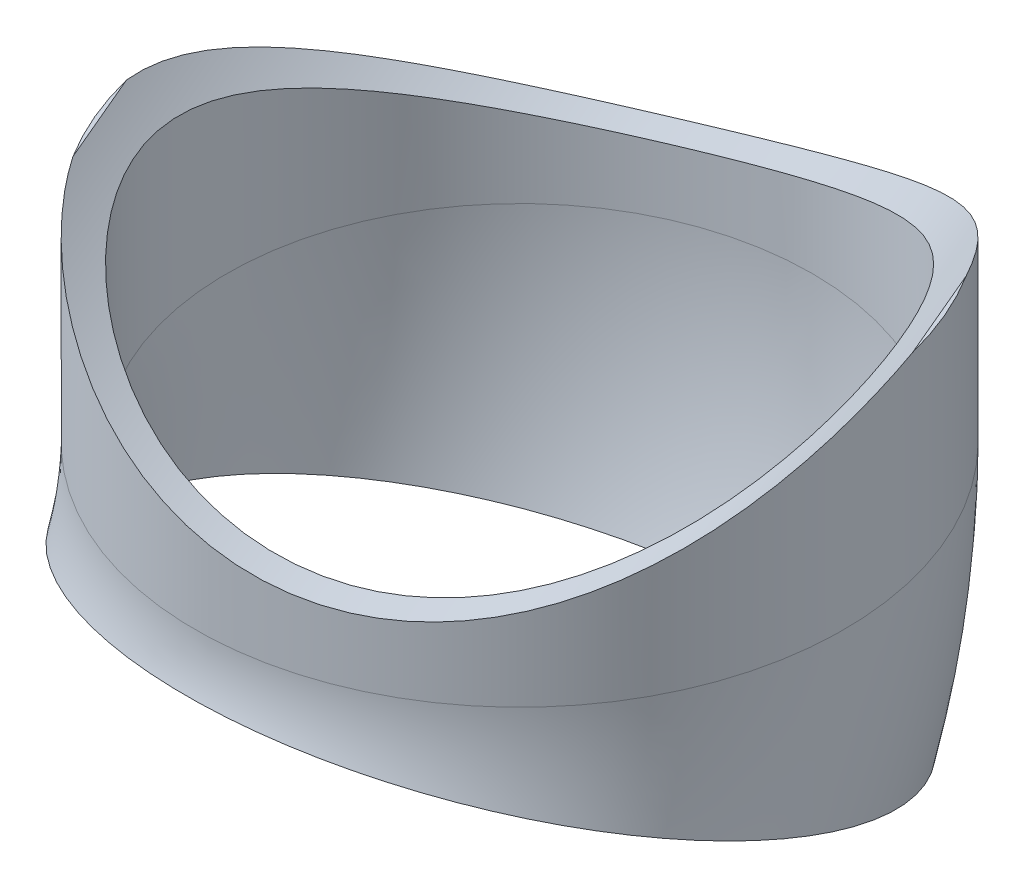
ISO-10303-21;
HEADER;
FILE_DESCRIPTION(('STEP AP214'),'2;1');
FILE_NAME('part.step','',(''),(''),'','','');
FILE_SCHEMA(('AUTOMOTIVE_DESIGN { 1 0 10303 214 1 1 1 1 }'));
ENDSEC;
DATA;
#1=APPLICATION_CONTEXT('core data for automotive mechanical design processes');
#2=APPLICATION_PROTOCOL_DEFINITION('international standard','automotive_design',2000,#1);
#3=PRODUCT_CONTEXT('',#1,'mechanical');
#4=PRODUCT('Part','Part','',(#3));
#5=PRODUCT_RELATED_PRODUCT_CATEGORY('part','',(#4));
#6=PRODUCT_DEFINITION_FORMATION('','',#4);
#7=PRODUCT_DEFINITION_CONTEXT('part definition',#1,'design');
#8=PRODUCT_DEFINITION('design','',#6,#7);
#9=PRODUCT_DEFINITION_SHAPE('','',#8);
#10=(LENGTH_UNIT() NAMED_UNIT(*) SI_UNIT(.MILLI.,.METRE.));
#11=(NAMED_UNIT(*) PLANE_ANGLE_UNIT() SI_UNIT($,.RADIAN.));
#12=(NAMED_UNIT(*) SI_UNIT($,.STERADIAN.) SOLID_ANGLE_UNIT());
#13=UNCERTAINTY_MEASURE_WITH_UNIT(LENGTH_MEASURE(1.E-05),#10,'distance_accuracy_value','');
#14=(GEOMETRIC_REPRESENTATION_CONTEXT(3) GLOBAL_UNCERTAINTY_ASSIGNED_CONTEXT((#13)) GLOBAL_UNIT_ASSIGNED_CONTEXT((#10,
#11,#12)) REPRESENTATION_CONTEXT('',''));
#15=CARTESIAN_POINT('',(0.,0.,0.));
#16=DIRECTION('',(0.,0.,1.));
#17=DIRECTION('',(1.,0.,0.));
#18=AXIS2_PLACEMENT_3D('',#15,#16,#17);
#19=CARTESIAN_POINT('',(0.,7.9375,0.));
#20=DIRECTION('',(0.,1.,0.));
#21=DIRECTION('',(0.,0.,1.));
#22=AXIS2_PLACEMENT_3D('',#19,#20,#21);
#23=PLANE('',#22);
#24=DIRECTION('',(0.390731128489278,0.,0.920504853452439));
#25=VECTOR('',#24,1.);
#26=CARTESIAN_POINT('',(-22.3861132780056,7.9375,-12.93028808634));
#27=LINE('',#26,#25);
#28=CARTESIAN_POINT('',(-15.2799945251246,7.9375,3.81067858945914));
#29=VERTEX_POINT('',#28);
#30=CARTESIAN_POINT('',(-13.3555488731417,7.9375,8.34438843158224));
#31=VERTEX_POINT('',#30);
#32=EDGE_CURVE('E60',#29,#31,#27,.T.);
#33=ORIENTED_EDGE('',*,*,#32,.F.);
#34=CARTESIAN_POINT('',(0.,7.9375,0.));
#35=DIRECTION('',(0.,1.,0.));
#36=DIRECTION('',(0.,0.,1.));
#37=AXIS2_PLACEMENT_3D('',#34,#35,#36);
#38=CIRCLE('',#37,15.748);
#39=EDGE_CURVE('E48',#29,#31,#38,.T.);
#40=ORIENTED_EDGE('',*,*,#39,.T.);
#41=EDGE_LOOP('',(#33,#40));
#42=FACE_BOUND('',#41,.T.);
#43=ADVANCED_FACE('F33',(#42),#23,.T.);
#44=DIRECTION('',(0.390731128489278,0.,0.920504853452439));
#45=VECTOR('',#44,1.);
#46=CARTESIAN_POINT('',(6.24943012026066,7.9375,-25.0853551073814));
#47=LINE('',#46,#45);
#48=CARTESIAN_POINT('',(15.2799945251246,7.9375,-3.81067858945914));
#49=VERTEX_POINT('',#48);
#50=CARTESIAN_POINT('',(13.3555488731417,7.9375,-8.34438843158225));
#51=VERTEX_POINT('',#50);
#52=EDGE_CURVE('E55',#49,#51,#47,.F.);
#53=ORIENTED_EDGE('',*,*,#52,.F.);
#54=EDGE_CURVE('E11',#49,#51,#38,.T.);
#55=ORIENTED_EDGE('',*,*,#54,.T.);
#56=EDGE_LOOP('',(#53,#55));
#57=FACE_BOUND('',#56,.T.);
#58=ADVANCED_FACE('F119',(#57),#23,.T.);
#59=CARTESIAN_POINT('',(0.,7.9375,0.));
#60=DIRECTION('',(0.,-1.,0.));
#61=DIRECTION('',(0.,0.,-1.));
#62=AXIS2_PLACEMENT_3D('',#59,#60,#61);
#63=CYLINDRICAL_SURFACE('',#62,15.748);
#64=ORIENTED_EDGE('',*,*,#54,.F.);
#65=CARTESIAN_POINT('',(15.2799945251246,7.9375,-3.81067858945914));
#66=CARTESIAN_POINT('',(15.3320366857805,7.90455896285192,-3.60201193193875));
#67=CARTESIAN_POINT('',(15.3796372478099,7.86764607105217,-3.39292524159516));
#68=CARTESIAN_POINT('',(15.4660149873519,7.78651333210653,-2.97447251707182));
#69=CARTESIAN_POINT('',(15.5047972060592,7.74229768482387,-2.76510671166591));
#70=CARTESIAN_POINT('',(15.6079367863265,7.59979518448622,-2.13798860250518));
#71=CARTESIAN_POINT('',(15.6593141877781,7.49150302754385,-1.72029771874254));
#72=CARTESIAN_POINT('',(15.7281885461575,7.2546596805107,-0.891731495380128));
#73=CARTESIAN_POINT('',(15.745953416413,7.12627759844423,-0.480828363020215));
#74=CARTESIAN_POINT('',(15.7497131185979,6.85374341717223,0.335895558816913));
#75=CARTESIAN_POINT('',(15.735701168257,6.70958795763341,0.741715244722722));
#76=CARTESIAN_POINT('',(15.6772709493108,6.41142660076566,1.54371878798323));
#77=CARTESIAN_POINT('',(15.6330971473558,6.25750885964597,1.93995379222663));
#78=CARTESIAN_POINT('',(15.5154870485849,5.94290225423745,2.72520629041811));
#79=CARTESIAN_POINT('',(15.4420562501851,5.78221466731164,3.11422512616859));
#80=CARTESIAN_POINT('',(15.2662318549309,5.45710671647442,3.88570769116736));
#81=CARTESIAN_POINT('',(15.1637394747287,5.29267541145137,4.26814426077968));
#82=CARTESIAN_POINT('',(14.9302658599472,4.96392967867222,5.02426441075635));
#83=CARTESIAN_POINT('',(14.7992838870286,4.79961525405594,5.39794776399339));
#84=CARTESIAN_POINT('',(14.4815605470954,4.44340242365529,6.20531743484061));
#85=CARTESIAN_POINT('',(14.2889601592404,4.25215627721452,6.63700501507327));
#86=CARTESIAN_POINT('',(13.8638223441698,3.87900257193419,7.48456902365025));
#87=CARTESIAN_POINT('',(13.6312782743032,3.69709657291124,7.90044280808133));
#88=CARTESIAN_POINT('',(13.1267799557184,3.3476259387248,8.71293544911435));
#89=CARTESIAN_POINT('',(12.854898566242,3.18003568168934,9.10958813182908));
#90=CARTESIAN_POINT('',(12.4178310399822,2.94266439910452,9.68789857060618));
#91=CARTESIAN_POINT('',(12.2672826259806,2.86588265983027,9.87787412084352));
#92=CARTESIAN_POINT('',(11.9564667763607,2.71749166032052,10.2519043402803));
#93=CARTESIAN_POINT('',(11.7961968714701,2.6458837244443,10.435957486858));
#94=CARTESIAN_POINT('',(11.380386635753,2.4727078558115,10.8914925826181));
#95=CARTESIAN_POINT('',(11.1185918782349,2.37489183875273,11.1587435192569));
#96=CARTESIAN_POINT('',(10.5738904665414,2.19439232260658,11.676190807934));
#97=CARTESIAN_POINT('',(10.2909883151123,2.11170560897215,11.9263907757125));
#98=CARTESIAN_POINT('',(9.70536946177965,1.96314191651582,12.4076120138336));
#99=CARTESIAN_POINT('',(9.40266300666182,1.89725632984624,12.6386430640339));
#100=CARTESIAN_POINT('',(8.77895724999061,1.78366904663009,13.0795742311575));
#101=CARTESIAN_POINT('',(8.45795753802717,1.73596775823384,13.2894738737044));
#102=CARTESIAN_POINT('',(7.79843639489727,1.65969101591434,13.6869542550627));
#103=CARTESIAN_POINT('',(7.45984935329477,1.63119368986164,13.8744412999822));
#104=CARTESIAN_POINT('',(6.76888814955622,1.59432187884636,14.2243317172691));
#105=CARTESIAN_POINT('',(6.41651399688963,1.58594738006299,14.3867351068644));
#106=CARTESIAN_POINT('',(5.70082671266374,1.5895261580785,14.685039350997));
#107=CARTESIAN_POINT('',(5.33751365729834,1.60147929331932,14.8209403900847));
#108=CARTESIAN_POINT('',(4.60296445361042,1.64542127263834,15.065258948858));
#109=CARTESIAN_POINT('',(4.23172857176633,1.67740944387548,15.1736773913261));
#110=CARTESIAN_POINT('',(3.50808096437277,1.75800846448209,15.356536444526));
#111=CARTESIAN_POINT('',(3.15596875403457,1.80543630018448,15.4326960006647));
#112=CARTESIAN_POINT('',(2.44983149525711,1.91623038484285,15.5604164529968));
#113=CARTESIAN_POINT('',(2.09580654570445,1.97959581741311,15.6119786087731));
#114=CARTESIAN_POINT('',(1.38798306538087,2.12106640568188,15.6907565108017));
#115=CARTESIAN_POINT('',(1.03418456032579,2.19917301157121,15.7179698601808));
#116=CARTESIAN_POINT('',(0.328772370283485,2.36873010806692,15.7485260427282));
#117=CARTESIAN_POINT('',(-0.022841191488344,2.46018134422288,15.7518675416815));
#118=CARTESIAN_POINT('',(-0.748010755051236,2.66209363965791,15.7347084735392));
#119=CARTESIAN_POINT('',(-1.12127218343758,2.77345933453348,15.7124310702584));
#120=CARTESIAN_POINT('',(-1.86161793376789,3.00784374431504,15.6420005551283));
#121=CARTESIAN_POINT('',(-2.22870201326365,3.13086291534561,15.5938464301026));
#122=CARTESIAN_POINT('',(-2.95543492776441,3.38656266588515,15.4725782145211));
#123=CARTESIAN_POINT('',(-3.31508096173873,3.5192468029466,15.3994548962229));
#124=CARTESIAN_POINT('',(-4.02571565546071,3.79217018205666,15.2291382975809));
#125=CARTESIAN_POINT('',(-4.37670327916049,3.93241032190976,15.1319421519459));
#126=CARTESIAN_POINT('',(-5.12942537058212,4.24323711181093,14.8953043442459));
#127=CARTESIAN_POINT('',(-5.52935234547447,4.41485531423962,14.7514533854227));
#128=CARTESIAN_POINT('',(-6.3148671469826,4.76208040701232,14.4326601119621));
#129=CARTESIAN_POINT('',(-6.70045273529299,4.93768791314755,14.257712968464));
#130=CARTESIAN_POINT('',(-7.45669873005661,5.28936906876153,13.8771955739696));
#131=CARTESIAN_POINT('',(-7.82733971376304,5.46544302679361,13.6715870063728));
#132=CARTESIAN_POINT('',(-8.5521107729005,5.81375391037324,13.2303017332828));
#133=CARTESIAN_POINT('',(-8.90624333197006,5.98599141105399,12.9946295708232));
#134=CARTESIAN_POINT('',(-9.56131612678734,6.30482484131958,12.5190763544857));
#135=CARTESIAN_POINT('',(-9.86398194867364,6.45223646215437,12.2821189725747));
#136=CARTESIAN_POINT('',(-10.4540286372952,6.73667425653732,11.7839663307474));
#137=CARTESIAN_POINT('',(-10.7414072427568,6.87369889491774,11.522767500651));
#138=CARTESIAN_POINT('',(-11.2983011918544,7.13273048934452,10.9772162806014));
#139=CARTESIAN_POINT('',(-11.5678785905545,7.25479104170177,10.6929529676111));
#140=CARTESIAN_POINT('',(-12.0882556360509,7.47995977545273,10.1009242493588));
#141=CARTESIAN_POINT('',(-12.3390692117965,7.58308209967954,9.7931766270123));
#142=CARTESIAN_POINT('',(-12.7157767376615,7.72637589128562,9.29300789629001));
#143=CARTESIAN_POINT('',(-12.8488284315008,7.77449711313874,9.10819833694832));
#144=CARTESIAN_POINT('',(-13.1077343111177,7.8624346193465,8.73150083820581));
#145=CARTESIAN_POINT('',(-13.2335834372788,7.90224511637193,8.53960807499182));
#146=CARTESIAN_POINT('',(-13.3555488731417,7.9375,8.34438843158225));
#147=B_SPLINE_CURVE_WITH_KNOTS('',3,(#65,#66,#67,#68,#69,#70,#71,#72,#73,#74,#75,#76,#77,#78,
#79,#80,#81,#82,#83,#84,#85,#86,#87,#88,#89,#90,#91,#92,#93,#94,#95,#96,#97,#98,#99,#100,#101,
#102,#103,#104,#105,#106,#107,#108,#109,#110,#111,#112,#113,#114,#115,#116,#117,#118,#119,#120,
#121,#122,#123,#124,#125,#126,#127,#128,#129,#130,#131,#132,#133,#134,#135,#136,#137,#138,#139,
#140,#141,#142,#143,#144,#145,#146),.UNSPECIFIED.,.F.,.F.,(4,2,2,2,2,2,2,2,2,2,2,2,2,2,2,2,2,2,
2,2,2,2,2,2,2,2,2,2,2,2,2,2,2,2,2,2,2,2,2,2,4),(0.,0.65251695353342,1.30465993865147,
2.60608767096509,3.89709776424905,5.1883834295797,6.46932534730935,7.75002664457606,
9.03513446661511,10.3202755976084,11.8481652554106,13.3763092483388,14.9016582617825,
15.6641942611229,16.4269247633858,17.5857317989055,18.7442923342227,19.9022580975093,
21.0602498500459,22.2229246928738,23.3855987371513,24.5482646848045,25.7108915884826,
26.7997766033503,27.8886058526466,28.9775422734677,30.0665395552583,31.2358642230315,
32.4052346778508,33.5750377597413,34.7449801455224,36.11867167876,37.4925767163188,
38.8682132944252,40.2436422401289,41.4776652797049,42.7118703503554,43.9415170799113,
45.1702417569446,45.8681613657321,46.5665653745507),.UNSPECIFIED.);
#148=EDGE_CURVE('E73',#49,#31,#147,.T.);
#149=ORIENTED_EDGE('',*,*,#148,.T.);
#150=ORIENTED_EDGE('',*,*,#39,.F.);
#151=CARTESIAN_POINT('',(-15.2799945251246,7.9375,3.81067858945914));
#152=CARTESIAN_POINT('',(-15.3320366857805,7.90455896285192,3.60201193193875));
#153=CARTESIAN_POINT('',(-15.3796372478099,7.86764607105217,3.39292524159516));
#154=CARTESIAN_POINT('',(-15.4660149873519,7.78651333210653,2.97447251707182));
#155=CARTESIAN_POINT('',(-15.5047972060592,7.74229768482387,2.76510671166591));
#156=CARTESIAN_POINT('',(-15.6079367863265,7.59979518448621,2.13798860250518));
#157=CARTESIAN_POINT('',(-15.6593141877781,7.49150302754385,1.72029771874254));
#158=CARTESIAN_POINT('',(-15.7281885461575,7.25465968051069,0.89173149538013));
#159=CARTESIAN_POINT('',(-15.745953416413,7.12627759844423,0.480828363020217));
#160=CARTESIAN_POINT('',(-15.7497131185979,6.85374341717223,-0.335895558816912));
#161=CARTESIAN_POINT('',(-15.735701168257,6.70958795763341,-0.741715244722721));
#162=CARTESIAN_POINT('',(-15.6772709493108,6.41142660076567,-1.54371878798323));
#163=CARTESIAN_POINT('',(-15.6330971473558,6.25750885964598,-1.93995379222663));
#164=CARTESIAN_POINT('',(-15.5154870485849,5.94290225423746,-2.72520629041811));
#165=CARTESIAN_POINT('',(-15.4420562501851,5.78221466731164,-3.11422512616859));
#166=CARTESIAN_POINT('',(-15.2662318549309,5.45710671647442,-3.88570769116736));
#167=CARTESIAN_POINT('',(-15.1637394747287,5.29267541145137,-4.26814426077968));
#168=CARTESIAN_POINT('',(-14.9302658599472,4.96392967867222,-5.02426441075635));
#169=CARTESIAN_POINT('',(-14.7992838870286,4.79961525405595,-5.39794776399339));
#170=CARTESIAN_POINT('',(-14.4815605470954,4.44340242365529,-6.20531743484061));
#171=CARTESIAN_POINT('',(-14.2889601592404,4.25215627721452,-6.63700501507327));
#172=CARTESIAN_POINT('',(-13.8638223441698,3.87900257193419,-7.48456902365024));
#173=CARTESIAN_POINT('',(-13.6312782743032,3.69709657291123,-7.90044280808133));
#174=CARTESIAN_POINT('',(-13.1267799557185,3.3476259387248,-8.71293544911435));
#175=CARTESIAN_POINT('',(-12.854898566242,3.18003568168934,-9.10958813182908));
#176=CARTESIAN_POINT('',(-12.4178310399822,2.94266439910452,-9.68789857060618));
#177=CARTESIAN_POINT('',(-12.2672826259806,2.86588265983028,-9.87787412084352));
#178=CARTESIAN_POINT('',(-11.9564667763607,2.71749166032052,-10.2519043402803));
#179=CARTESIAN_POINT('',(-11.7961968714701,2.6458837244443,-10.435957486858));
#180=CARTESIAN_POINT('',(-11.380386635753,2.4727078558115,-10.8914925826181));
#181=CARTESIAN_POINT('',(-11.1185918782349,2.37489183875273,-11.1587435192569));
#182=CARTESIAN_POINT('',(-10.5738904665414,2.19439232260658,-11.676190807934));
#183=CARTESIAN_POINT('',(-10.2909883151123,2.11170560897215,-11.9263907757125));
#184=CARTESIAN_POINT('',(-9.70536946177965,1.96314191651582,-12.4076120138336));
#185=CARTESIAN_POINT('',(-9.40266300666183,1.89725632984624,-12.6386430640339));
#186=CARTESIAN_POINT('',(-8.77895724999062,1.78366904663009,-13.0795742311575));
#187=CARTESIAN_POINT('',(-8.45795753802718,1.73596775823384,-13.2894738737044));
#188=CARTESIAN_POINT('',(-7.79843639489728,1.65969101591435,-13.6869542550627));
#189=CARTESIAN_POINT('',(-7.45984935329478,1.63119368986164,-13.8744412999822));
#190=CARTESIAN_POINT('',(-6.76888814955623,1.59432187884636,-14.2243317172691));
#191=CARTESIAN_POINT('',(-6.41651399688963,1.58594738006299,-14.3867351068644));
#192=CARTESIAN_POINT('',(-5.70082671266374,1.5895261580785,-14.685039350997));
#193=CARTESIAN_POINT('',(-5.33751365729835,1.60147929331932,-14.8209403900847));
#194=CARTESIAN_POINT('',(-4.60296445361043,1.64542127263834,-15.065258948858));
#195=CARTESIAN_POINT('',(-4.23172857176634,1.67740944387548,-15.1736773913261));
#196=CARTESIAN_POINT('',(-3.50808096437278,1.75800846448209,-15.356536444526));
#197=CARTESIAN_POINT('',(-3.15596875403458,1.80543630018448,-15.4326960006647));
#198=CARTESIAN_POINT('',(-2.44983149525712,1.91623038484285,-15.5604164529968));
#199=CARTESIAN_POINT('',(-2.09580654570446,1.97959581741311,-15.6119786087731));
#200=CARTESIAN_POINT('',(-1.38798306538088,2.12106640568187,-15.6907565108017));
#201=CARTESIAN_POINT('',(-1.03418456032579,2.1991730115712,-15.7179698601808));
#202=CARTESIAN_POINT('',(-0.32877237028349,2.36873010806692,-15.7485260427282));
#203=CARTESIAN_POINT('',(0.0228411914883391,2.46018134422288,-15.7518675416815));
#204=CARTESIAN_POINT('',(0.748010755051232,2.66209363965791,-15.7347084735392));
#205=CARTESIAN_POINT('',(1.12127218343757,2.77345933453347,-15.7124310702584));
#206=CARTESIAN_POINT('',(1.86161793376789,3.00784374431504,-15.6420005551283));
#207=CARTESIAN_POINT('',(2.22870201326365,3.13086291534561,-15.5938464301026));
#208=CARTESIAN_POINT('',(2.95543492776441,3.38656266588515,-15.4725782145211));
#209=CARTESIAN_POINT('',(3.31508096173873,3.5192468029466,-15.3994548962229));
#210=CARTESIAN_POINT('',(4.02571565546071,3.79217018205666,-15.2291382975809));
#211=CARTESIAN_POINT('',(4.37670327916049,3.93241032190976,-15.1319421519459));
#212=CARTESIAN_POINT('',(5.12942537058212,4.24323711181092,-14.8953043442459));
#213=CARTESIAN_POINT('',(5.52935234547447,4.41485531423961,-14.7514533854227));
#214=CARTESIAN_POINT('',(6.31486714698259,4.76208040701231,-14.4326601119621));
#215=CARTESIAN_POINT('',(6.70045273529299,4.93768791314755,-14.257712968464));
#216=CARTESIAN_POINT('',(7.45669873005661,5.28936906876153,-13.8771955739696));
#217=CARTESIAN_POINT('',(7.82733971376304,5.46544302679362,-13.6715870063728));
#218=CARTESIAN_POINT('',(8.5521107729005,5.81375391037324,-13.2303017332828));
#219=CARTESIAN_POINT('',(8.90624333197006,5.98599141105398,-12.9946295708232));
#220=CARTESIAN_POINT('',(9.56131612678734,6.30482484131957,-12.5190763544857));
#221=CARTESIAN_POINT('',(9.86398194867363,6.45223646215437,-12.2821189725747));
#222=CARTESIAN_POINT('',(10.4540286372952,6.73667425653731,-11.7839663307474));
#223=CARTESIAN_POINT('',(10.7414072427568,6.87369889491773,-11.522767500651));
#224=CARTESIAN_POINT('',(11.2983011918544,7.13273048934452,-10.9772162806014));
#225=CARTESIAN_POINT('',(11.5678785905545,7.25479104170177,-10.6929529676111));
#226=CARTESIAN_POINT('',(12.0882556360509,7.47995977545273,-10.1009242493588));
#227=CARTESIAN_POINT('',(12.3390692117965,7.58308209967955,-9.7931766270123));
#228=CARTESIAN_POINT('',(12.7157767376615,7.72637589128562,-9.29300789629001));
#229=CARTESIAN_POINT('',(12.8488284315008,7.77449711313875,-9.10819833694832));
#230=CARTESIAN_POINT('',(13.1077343111177,7.8624346193465,-8.73150083820581));
#231=CARTESIAN_POINT('',(13.2335834372788,7.90224511637193,-8.53960807499182));
#232=CARTESIAN_POINT('',(13.3555488731417,7.9375,-8.34438843158225));
#233=B_SPLINE_CURVE_WITH_KNOTS('',3,(#151,#152,#153,#154,#155,#156,#157,#158,#159,#160,#161,
#162,#163,#164,#165,#166,#167,#168,#169,#170,#171,#172,#173,#174,#175,#176,#177,#178,#179,#180,
#181,#182,#183,#184,#185,#186,#187,#188,#189,#190,#191,#192,#193,#194,#195,#196,#197,#198,#199,
#200,#201,#202,#203,#204,#205,#206,#207,#208,#209,#210,#211,#212,#213,#214,#215,#216,#217,#218,
#219,#220,#221,#222,#223,#224,#225,#226,#227,#228,#229,#230,#231,#232),.UNSPECIFIED.,.F.,.F.,(4,
2,2,2,2,2,2,2,2,2,2,2,2,2,2,2,2,2,2,2,2,2,2,2,2,2,2,2,2,2,2,2,2,2,2,2,2,2,2,2,4),(0.,
0.65251695353342,1.30465993865147,2.60608767096509,3.89709776424905,5.1883834295797,
6.46932534730935,7.75002664457606,9.03513446661511,10.3202755976084,11.8481652554106,
13.3763092483388,14.9016582617824,15.6641942611229,16.4269247633858,17.5857317989055,
18.7442923342227,19.9022580975093,21.0602498500459,22.2229246928738,23.3855987371513,
24.5482646848045,25.7108915884826,26.7997766033503,27.8886058526466,28.9775422734677,
30.0665395552583,31.2358642230315,32.4052346778508,33.5750377597413,34.7449801455224,
36.11867167876,37.4925767163188,38.8682132944252,40.2436422401289,41.4776652797049,
42.7118703503554,43.9415170799113,45.1702417569446,45.8681613657321,46.5665653745507),.UNSPECIFIED.);
#234=EDGE_CURVE('E65',#29,#51,#233,.T.);
#235=ORIENTED_EDGE('',*,*,#234,.T.);
#236=EDGE_LOOP('',(#64,#149,#150,#235));
#237=FACE_BOUND('',#236,.T.);
#238=CARTESIAN_POINT('',(0.,-1.5875,0.));
#239=DIRECTION('',(0.,-1.,0.));
#240=DIRECTION('',(0.,0.,-1.));
#241=AXIS2_PLACEMENT_3D('',#238,#239,#240);
#242=CIRCLE('',#241,15.748);
#243=CARTESIAN_POINT('',(0.,-1.5875,-15.748));
#244=VERTEX_POINT('',#243);
#245=EDGE_CURVE('E81',#244,#244,#242,.T.);
#246=ORIENTED_EDGE('',*,*,#245,.F.);
#247=EDGE_LOOP('',(#246));
#248=FACE_BOUND('',#247,.T.);
#249=ADVANCED_FACE('F35',(#237,#248),#63,.T.);
#250=CARTESIAN_POINT('',(0.,7.9375,0.));
#251=DIRECTION('',(0.,-1.,0.));
#252=DIRECTION('',(0.,0.,-1.));
#253=AXIS2_PLACEMENT_3D('',#250,#251,#252);
#254=CYLINDRICAL_SURFACE('',#253,14.224);
#255=CARTESIAN_POINT('',(0.,2.29362610883324,-14.224));
#256=CARTESIAN_POINT('',(0.414724889266662,2.39222594880136,-14.2239978545619));
#257=CARTESIAN_POINT('',(0.827468260004088,2.49937487193509,-14.2058474139058));
#258=CARTESIAN_POINT('',(1.64597172828608,2.72782291037923,-14.1344207339034));
#259=CARTESIAN_POINT('',(2.05172973003408,2.8491261903052,-14.0811341349396));
#260=CARTESIAN_POINT('',(2.85441169710275,3.10294166449447,-13.9406160010591));
#261=CARTESIAN_POINT('',(3.25132130095781,3.23547061202887,-13.8533330054799));
#262=CARTESIAN_POINT('',(4.03368863782523,3.50831803752762,-13.6460730642698));
#263=CARTESIAN_POINT('',(4.41914720142081,3.64863594840357,-13.5260984963234));
#264=CARTESIAN_POINT('',(5.17537787890002,3.9330820667374,-13.2551224522879));
#265=CARTESIAN_POINT('',(5.54620699909697,4.0771908599919,-13.1042593869243));
#266=CARTESIAN_POINT('',(6.27357822451755,4.36634178139485,-12.7720112344241));
#267=CARTESIAN_POINT('',(6.63011949402221,4.51138396356448,-12.5906243651189));
#268=CARTESIAN_POINT('',(7.32733897578807,4.79862145375168,-12.1980435517966));
#269=CARTESIAN_POINT('',(7.66802512745766,4.9408181658463,-11.9868647443177));
#270=CARTESIAN_POINT('',(8.33219882491631,5.21843518391004,-11.5350726224381));
#271=CARTESIAN_POINT('',(8.65568889221331,5.35385648320391,-11.2944636406375));
#272=CARTESIAN_POINT('',(9.23660636932003,5.59410019826073,-10.8224564220017));
#273=CARTESIAN_POINT('',(9.49666838360118,5.7004666747811,-10.5950826838755));
#274=CARTESIAN_POINT('',(10.0017062412561,5.90227193003549,-10.1196968467644));
#275=CARTESIAN_POINT('',(10.2466850804169,5.99771288203007,-9.87168886926552));
#276=CARTESIAN_POINT('',(10.7197559981834,6.17460698880449,-9.35581883859647));
#277=CARTESIAN_POINT('',(10.9478644234741,6.25607378767044,-9.08797652144377));
#278=CARTESIAN_POINT('',(11.3855853855103,6.4021727920944,-8.53319607377132));
#279=CARTESIAN_POINT('',(11.5951980939831,6.46680515396595,-8.24625812059218));
#280=CARTESIAN_POINT('',(11.9957615875051,6.57706315992926,-7.65202279638297));
#281=CARTESIAN_POINT('',(12.1865161725391,6.62250241231792,-7.34455791085465));
#282=CARTESIAN_POINT('',(12.5449250475758,6.69131939391603,-6.71405223304992));
#283=CARTESIAN_POINT('',(12.7125799381218,6.71469769675601,-6.3910118459985));
#284=CARTESIAN_POINT('',(13.0227861656776,6.73819473814143,-5.732503962201));
#285=CARTESIAN_POINT('',(13.1653524244996,6.73832734941168,-5.39704399686989));
#286=CARTESIAN_POINT('',(13.4240647576891,6.7153560256442,-4.7168868865555));
#287=CARTESIAN_POINT('',(13.5402128437878,6.69225386065038,-4.37219044716123));
#288=CARTESIAN_POINT('',(13.7306828170096,6.6288768294268,-3.72654983039605));
#289=CARTESIAN_POINT('',(13.8086059093411,6.59151684167351,-3.42636735296553));
#290=CARTESIAN_POINT('',(13.9443478719192,6.50190204442122,-2.82361348058557));
#291=CARTESIAN_POINT('',(14.0021610071663,6.44964299369521,-2.52104142929069));
#292=CARTESIAN_POINT('',(14.0978195200404,6.33186945254291,-1.91515045453678));
#293=CARTESIAN_POINT('',(14.1356522788612,6.26634662128718,-1.61183118034426));
#294=CARTESIAN_POINT('',(14.1916386485316,6.12394227689069,-1.00604825220754));
#295=CARTESIAN_POINT('',(14.2097895970939,6.0470592286923,-0.703584719534002));
#296=CARTESIAN_POINT('',(14.2298021308092,5.8555198300607,0.00409098502987477));
#297=CARTESIAN_POINT('',(14.2238155328289,5.73701908550926,0.408499598712754));
#298=CARTESIAN_POINT('',(14.1780258339369,5.48760823447119,1.21141119322656));
#299=CARTESIAN_POINT('',(14.1382235467172,5.3566984266457,1.60991431592396));
#300=CARTESIAN_POINT('',(14.0257516271193,5.08663501230756,2.39997429269028));
#301=CARTESIAN_POINT('',(13.9530393949109,4.94747092467726,2.79152145786662));
#302=CARTESIAN_POINT('',(13.7755410125091,4.6650818948432,3.56572107247399));
#303=CARTESIAN_POINT('',(13.6707571900536,4.52185724803685,3.94837416526384));
#304=CARTESIAN_POINT('',(13.428259337032,4.2333343223901,4.70795468096354));
#305=CARTESIAN_POINT('',(13.2901700938329,4.0880315701323,5.08476066552977));
#306=CARTESIAN_POINT('',(12.9821546396132,3.80061923802304,5.82641054110257));
#307=CARTESIAN_POINT('',(12.812227953025,3.6585097059054,6.19125425332859));
#308=CARTESIAN_POINT('',(12.4409152280997,3.38091300410458,6.90712211509462));
#309=CARTESIAN_POINT('',(12.2395358080477,3.24542444909163,7.25814915252881));
#310=CARTESIAN_POINT('',(11.8056873725963,2.98430983391625,7.94434887224022));
#311=CARTESIAN_POINT('',(11.5732182209548,2.85868381697746,8.27952148503117));
#312=CARTESIAN_POINT('',(11.0705554359931,2.61697533125007,8.94105804705988));
#313=CARTESIAN_POINT('',(10.7994586615415,2.5012785071867,9.26687923822644));
#314=CARTESIAN_POINT('',(10.2260574521846,2.28696800553847,9.89601136180167));
#315=CARTESIAN_POINT('',(9.92375170931869,2.18835504439854,10.1993213498546));
#316=CARTESIAN_POINT('',(9.29006714414853,2.01134995451606,10.7796650263683));
#317=CARTESIAN_POINT('',(8.95872313712506,1.93293404337242,11.0567293741435));
#318=CARTESIAN_POINT('',(8.26923875246614,1.79878106859676,11.5814249937332));
#319=CARTESIAN_POINT('',(7.91110443909,1.74303889081427,11.8290628938696));
#320=CARTESIAN_POINT('',(7.22739454421559,1.66273737366417,12.2565940033543));
#321=CARTESIAN_POINT('',(6.90507607259998,1.63473895086363,12.4410695537173));
#322=CARTESIAN_POINT('',(6.24614342217813,1.59720857155633,12.7845945567111));
#323=CARTESIAN_POINT('',(5.90953086185191,1.58767453004614,12.9436468782793));
#324=CARTESIAN_POINT('',(5.22498490177822,1.58733026211599,13.2348034714504));
#325=CARTESIAN_POINT('',(4.87705551801849,1.59651346335058,13.3669171843181));
#326=CARTESIAN_POINT('',(4.17280607853865,1.63334205014555,13.6032275888215));
#327=CARTESIAN_POINT('',(3.81648626711574,1.66098689881294,13.7074250921798));
#328=CARTESIAN_POINT('',(3.13071191414697,1.73072656316069,13.879278783155));
#329=CARTESIAN_POINT('',(2.80170856716773,1.77130591584424,13.9493714608591));
#330=CARTESIAN_POINT('',(2.14154684136481,1.86628663889878,14.0658552911682));
#331=CARTESIAN_POINT('',(1.81038863744784,1.92068690075234,14.1122483437231));
#332=CARTESIAN_POINT('',(1.14795591723199,2.04221397437256,14.1815124793068));
#333=CARTESIAN_POINT('',(0.816681396413715,2.10934135225655,14.2043825157129));
#334=CARTESIAN_POINT('',(0.155870325561101,2.25503987888351,14.2269883121291));
#335=CARTESIAN_POINT('',(-0.173666117197328,2.33361172562047,14.2267226605119));
#336=CARTESIAN_POINT('',(-0.850932376526886,2.50628266725889,14.2028282913416));
#337=CARTESIAN_POINT('',(-1.19843389112531,2.60106298905386,14.17766468446));
#338=CARTESIAN_POINT('',(-1.88793181720281,2.80019065118955,14.1024175416577));
#339=CARTESIAN_POINT('',(-2.22992805272188,2.9045382966106,14.0523332108458));
#340=CARTESIAN_POINT('',(-2.90720816824733,3.1209594365177,13.9279908668804));
#341=CARTESIAN_POINT('',(-3.24248820025027,3.23303720527216,13.8537193939252));
#342=CARTESIAN_POINT('',(-3.90499455901538,3.46291083868696,13.6817521693282));
#343=CARTESIAN_POINT('',(-4.23222004683849,3.5807072952238,13.5840539889138));
#344=CARTESIAN_POINT('',(-4.9264620046979,3.83810911364282,13.3493807240232));
#345=CARTESIAN_POINT('',(-5.29200636858171,3.97831719703824,13.2086992356256));
#346=CARTESIAN_POINT('',(-6.00976003660923,4.26043255044295,12.8979815210394));
#347=CARTESIAN_POINT('',(-6.36196754664369,4.40234004570576,12.7279413624288));
#348=CARTESIAN_POINT('',(-7.05186044278452,4.68449364628885,12.3590656868931));
#349=CARTESIAN_POINT('',(-7.38954042052058,4.82473911902494,12.1602195642402));
#350=CARTESIAN_POINT('',(-8.04885085881078,5.09984285169287,11.7342312290415));
#351=CARTESIAN_POINT('',(-8.37048329440618,5.23470177416153,11.5070925106805));
#352=CARTESIAN_POINT('',(-8.9603732357521,5.48017758327824,11.0524321750491));
#353=CARTESIAN_POINT('',(-9.2305304515946,5.59180377203158,10.8279193868883));
#354=CARTESIAN_POINT('',(-9.7557940801464,5.80476828284722,10.35717406998));
#355=CARTESIAN_POINT('',(-10.0108954366429,5.90610315691709,10.1109343131496));
#356=CARTESIAN_POINT('',(-10.5040879858009,6.09519946826444,9.59754506332443));
#357=CARTESIAN_POINT('',(-10.7421951571226,6.18297374871812,9.33041572050464));
#358=CARTESIAN_POINT('',(-11.1996266554457,6.34184382172188,8.77607923642992));
#359=CARTESIAN_POINT('',(-11.4189617012315,6.41294917302931,8.48888372533551));
#360=CARTESIAN_POINT('',(-11.839077225197,6.53622673813155,7.89257967985027));
#361=CARTESIAN_POINT('',(-12.0396360196409,6.58818995344672,7.58327089073246));
#362=CARTESIAN_POINT('',(-12.4172288194244,6.66960515228927,6.94774649439264));
#363=CARTESIAN_POINT('',(-12.5942635211381,6.69905780231061,6.62153138803913));
#364=CARTESIAN_POINT('',(-12.9225522058793,6.73389410608222,5.95546424920061));
#365=CARTESIAN_POINT('',(-13.0738277528494,6.73929798816379,5.61562392031114));
#366=CARTESIAN_POINT('',(-13.3491150414989,6.72579140487293,4.92557136737291));
#367=CARTESIAN_POINT('',(-13.473129524163,6.70688338526996,4.57536019009058));
#368=CARTESIAN_POINT('',(-13.6757483700382,6.65056621528875,3.92348936132383));
#369=CARTESIAN_POINT('',(-13.7584196246846,6.61650677123465,3.62278683798323));
#370=CARTESIAN_POINT('',(-13.90349042451,6.53304338914348,3.01855613105779));
#371=CARTESIAN_POINT('',(-13.9658842488952,6.48363512847989,2.71502717486393));
#372=CARTESIAN_POINT('',(-14.0704878029321,6.37106744700188,2.10685484800986));
#373=CARTESIAN_POINT('',(-14.1126837050515,6.30789864862687,1.80221085735951));
#374=CARTESIAN_POINT('',(-14.1771440905331,6.16970119815683,1.19351064249172));
#375=CARTESIAN_POINT('',(-14.1994059479601,6.09467098507485,0.889454500975028));
#376=CARTESIAN_POINT('',(-14.2285477258078,5.90828876549096,0.18301104360289));
#377=CARTESIAN_POINT('',(-14.2279212149845,5.79312402634141,-0.218693160558433));
#378=CARTESIAN_POINT('',(-14.1932464328834,5.54987826957165,-1.0165936602717));
#379=CARTESIAN_POINT('',(-14.1591986600977,5.42179744462581,-1.41279003788578));
#380=CARTESIAN_POINT('',(-14.0586451464054,5.15684411051136,-2.19858021961107));
#381=CARTESIAN_POINT('',(-13.9920992033731,5.01996089486454,-2.58816522579386));
#382=CARTESIAN_POINT('',(-13.8273550116085,4.74153014184044,-3.3588231868974));
#383=CARTESIAN_POINT('',(-13.7291589296213,4.5999829243526,-3.73989672259802));
#384=CARTESIAN_POINT('',(-13.5003025325144,4.31411117844237,-4.49692037635789));
#385=CARTESIAN_POINT('',(-13.3692558742108,4.1697739486516,-4.8727489105703));
#386=CARTESIAN_POINT('',(-13.0757058612797,3.88352872153165,-5.6130845246063));
#387=CARTESIAN_POINT('',(-12.9131894671554,3.74162175780531,-5.97758683850209));
#388=CARTESIAN_POINT('',(-12.5570804473564,3.46365650937132,-6.69340580156733));
#389=CARTESIAN_POINT('',(-12.3634896804289,3.32759787545626,-7.04472323785465));
#390=CARTESIAN_POINT('',(-11.9456984244763,3.06461023991925,-7.73201786892009));
#391=CARTESIAN_POINT('',(-11.7215136255078,2.93767660918475,-8.06800280982249));
#392=CARTESIAN_POINT('',(-11.2327031947506,2.6907767626045,-8.73654818529297));
#393=CARTESIAN_POINT('',(-10.9667543900693,2.57134377773422,-9.06834205989599));
#394=CARTESIAN_POINT('',(-10.4030450962105,2.34908574026326,-9.70984672158423));
#395=CARTESIAN_POINT('',(-10.1052829455109,2.24626155579897,-10.0195563538613));
#396=CARTESIAN_POINT('',(-9.47994157915759,2.06047283190714,-10.6131285079079));
#397=CARTESIAN_POINT('',(-9.15239634279112,1.9774860430244,-10.8970197637387));
#398=CARTESIAN_POINT('',(-8.46966101044319,1.83397546422878,-11.4357319407582));
#399=CARTESIAN_POINT('',(-8.11447732261762,1.77344648598741,-11.6905595669547));
#400=CARTESIAN_POINT('',(-7.43429613598166,1.68411426130327,-12.1322979475128));
#401=CARTESIAN_POINT('',(-7.11263200722047,1.65193757712422,-12.3236765343524));
#402=CARTESIAN_POINT('',(-6.45417421903501,1.60625370848283,-12.6809324973832));
#403=CARTESIAN_POINT('',(-6.11738203506861,1.59274470740289,-12.8468123535488));
#404=CARTESIAN_POINT('',(-5.43175676206353,1.584769176639,-13.1513817581732));
#405=CARTESIAN_POINT('',(-5.08293114720852,1.59029103009802,-13.2900878394728));
#406=CARTESIAN_POINT('',(-4.37614838183513,1.62020067533887,-13.5392714236364));
#407=CARTESIAN_POINT('',(-4.01819201754501,1.64458684802416,-13.6497513480272));
#408=CARTESIAN_POINT('',(-3.3562977354497,1.70598606357948,-13.8258637578983));
#409=CARTESIAN_POINT('',(-3.05325906831961,1.7402302720179,-13.8958968441005));
#410=CARTESIAN_POINT('',(-2.44470228882228,1.82075027067992,-14.0157696220086));
#411=CARTESIAN_POINT('',(-2.13918348180659,1.86702955289156,-14.0656034421228));
#412=CARTESIAN_POINT('',(-1.52747506410866,1.97079988074126,-14.1451094008287));
#413=CARTESIAN_POINT('',(-1.22128552586991,2.02828976940271,-14.174783618551));
#414=CARTESIAN_POINT('',(-0.609708255937746,2.15352633267091,-14.214231260136));
#415=CARTESIAN_POINT('',(-0.304320656978298,2.22127460822735,-14.2240015742994));
#416=CARTESIAN_POINT('',(0.,2.29362610883324,-14.224));
#417=B_SPLINE_CURVE_WITH_KNOTS('',3,(#255,#256,#257,#258,#259,#260,#261,#262,#263,#264,#265,
#266,#267,#268,#269,#270,#271,#272,#273,#274,#275,#276,#277,#278,#279,#280,#281,#282,#283,#284,
#285,#286,#287,#288,#289,#290,#291,#292,#293,#294,#295,#296,#297,#298,#299,#300,#301,#302,#303,
#304,#305,#306,#307,#308,#309,#310,#311,#312,#313,#314,#315,#316,#317,#318,#319,#320,#321,#322,
#323,#324,#325,#326,#327,#328,#329,#330,#331,#332,#333,#334,#335,#336,#337,#338,#339,#340,#341,
#342,#343,#344,#345,#346,#347,#348,#349,#350,#351,#352,#353,#354,#355,#356,#357,#358,#359,#360,
#361,#362,#363,#364,#365,#366,#367,#368,#369,#370,#371,#372,#373,#374,#375,#376,#377,#378,#379,
#380,#381,#382,#383,#384,#385,#386,#387,#388,#389,#390,#391,#392,#393,#394,#395,#396,#397,#398,
#399,#400,#401,#402,#403,#404,#405,#406,#407,#408,#409,#410,#411,#412,#413,#414,#415,#416),
.UNSPECIFIED.,.T.,.F.,(4,2,2,2,2,2,2,2,2,2,2,2,2,2,2,2,2,2,2,2,2,2,2,2,2,2,2,2,2,2,2,2,2,2,2,2,
2,2,2,2,2,2,2,2,2,2,2,2,2,2,2,2,2,2,2,2,2,2,2,2,2,2,2,2,2,2,2,2,2,2,2,2,2,2,2,2,2,2,2,2,4),(0.,
1.2785147036816,2.55740653593608,3.83824180955402,5.11898395183469,6.39410801026148,
7.66930654416947,8.94385949950017,10.2182250452478,11.3015894621869,12.3847380048742,
13.4668228874309,14.548897722099,15.6412519903444,16.7335778543263,17.8252518302926,
18.9168426479576,19.8529437982833,20.7893116894392,21.7262702480213,22.6633555297931,
23.9259414082558,25.1884969065333,26.4526913974183,27.71679415553,28.9958642287287,
30.2749534093933,31.5537738057817,32.8325998064248,34.1487568702362,35.4649691162928,
36.7796243383067,38.0939828699759,39.2097401851673,40.3253715013626,41.4406111438855,
42.5558183549435,43.5711714747129,44.5864431829424,45.6017600622712,46.6171388913559,
47.6992752297518,48.7814460870391,49.8642201890824,50.9471065967037,52.1938654772368,
53.4407914835581,54.6881777531651,55.9354101208625,57.0401407750574,58.1452403445131,
59.2492867768594,60.3526985392028,61.4678236219402,62.5829156867182,63.6970696277497,
64.8111114940235,65.7512083273297,66.691570156775,67.6325748420621,68.5737034687797,
69.8255946424024,71.0774671438289,72.3308922222658,73.5842315103763,74.8530656872689,
76.1224267354227,77.3917118836478,78.6603485121225,79.9834607110596,81.3066420462614,
82.6283322750689,83.9497169692303,85.0751672827439,86.2005080670323,87.3251620399653,
88.4497194962247,89.3875576221899,90.3256681669736,91.2636819464228,92.2018422658307),.UNSPECIFIED.);
#418=CARTESIAN_POINT('',(0.,2.29362610883324,-14.224));
#419=VERTEX_POINT('',#418);
#420=EDGE_CURVE('E38',#419,#419,#417,.T.);
#421=ORIENTED_EDGE('',*,*,#420,.F.);
#422=EDGE_LOOP('',(#421));
#423=FACE_BOUND('',#422,.T.);
#424=CARTESIAN_POINT('',(0.,-1.5875,0.));
#425=DIRECTION('',(0.,-1.,0.));
#426=DIRECTION('',(0.,0.,-1.));
#427=AXIS2_PLACEMENT_3D('',#424,#425,#426);
#428=CIRCLE('',#427,14.224);
#429=CARTESIAN_POINT('',(0.,-1.5875,-14.224));
#430=VERTEX_POINT('',#429);
#431=EDGE_CURVE('E78',#430,#430,#428,.F.);
#432=ORIENTED_EDGE('',*,*,#431,.F.);
#433=EDGE_LOOP('',(#432));
#434=FACE_BOUND('',#433,.T.);
#435=ADVANCED_FACE('F110',(#423,#434),#254,.F.);
#436=CARTESIAN_POINT('',(0.,-1.5875,23.207697426294));
#437=DIRECTION('',(-1.,0.,0.));
#438=DIRECTION('',(0.,0.,1.));
#439=AXIS2_PLACEMENT_3D('',#436,#437,#438);
#440=TOROIDAL_SURFACE('',#439,23.207697426294,15.748);
#441=CARTESIAN_POINT('',(0.,-9.525,1.39959540937347));
#442=DIRECTION('',(0.,-0.939692620785906,0.342020143325676));
#443=DIRECTION('',(0.,-0.342020143325676,-0.939692620785906));
#444=AXIS2_PLACEMENT_3D('',#441,#442,#443);
#445=CIRCLE('',#444,15.748);
#446=CARTESIAN_POINT('',(0.,-14.9111332170927,-13.398683982763));
#447=VERTEX_POINT('',#446);
#448=EDGE_CURVE('E84',#447,#447,#445,.T.);
#449=CARTESIAN_POINT('',(0.,-1.5875,23.207697426294));
#450=DIRECTION('',(-1.,0.,0.));
#451=DIRECTION('',(0.,0.,1.));
#452=AXIS2_PLACEMENT_3D('',#449,#450,#451);
#453=CIRCLE('',#452,38.955697426294);
#454=EDGE_CURVE('',#244,#447,#453,.T.);
#455=ORIENTED_EDGE('',*,*,#245,.T.);
#456=ORIENTED_EDGE('',*,*,#448,.F.);
#457=ORIENTED_EDGE('',*,*,#454,.T.);
#458=ORIENTED_EDGE('',*,*,#454,.F.);
#459=EDGE_LOOP('',(#455,#457,#456,#458));
#460=FACE_BOUND('',#459,.T.);
#461=ADVANCED_FACE('F99',(#460),#440,.T.);
#462=CARTESIAN_POINT('',(0.,-9.525,1.39959540937347));
#463=DIRECTION('',(0.,-0.939692620785906,0.342020143325676));
#464=DIRECTION('',(0.,-0.342020143325676,-0.939692620785906));
#465=AXIS2_PLACEMENT_3D('',#462,#463,#464);
#466=PLANE('',#465);
#467=CARTESIAN_POINT('',(0.,-9.525,1.39959540937347));
#468=DIRECTION('',(0.,-0.939692620785906,0.342020143325676));
#469=DIRECTION('',(0.,-0.342020143325676,-0.939692620785906));
#470=AXIS2_PLACEMENT_3D('',#467,#468,#469);
#471=CIRCLE('',#470,14.224);
#472=CARTESIAN_POINT('',(0.,-14.3898945186644,-11.9665924286852));
#473=VERTEX_POINT('',#472);
#474=EDGE_CURVE('E76',#473,#473,#471,.F.);
#475=ORIENTED_EDGE('',*,*,#474,.T.);
#476=EDGE_LOOP('',(#475));
#477=FACE_BOUND('',#476,.T.);
#478=ORIENTED_EDGE('',*,*,#448,.T.);
#479=EDGE_LOOP('',(#478));
#480=FACE_BOUND('',#479,.T.);
#481=ADVANCED_FACE('F108',(#477,#480),#466,.T.);
#482=CARTESIAN_POINT('',(0.,-1.5875,23.207697426294));
#483=DIRECTION('',(-1.,0.,0.));
#484=DIRECTION('',(0.,0.,1.));
#485=AXIS2_PLACEMENT_3D('',#482,#483,#484);
#486=TOROIDAL_SURFACE('',#485,23.207697426294,14.224);
#487=CARTESIAN_POINT('',(0.,-1.5875,23.207697426294));
#488=DIRECTION('',(-1.,0.,0.));
#489=DIRECTION('',(0.,0.,1.));
#490=AXIS2_PLACEMENT_3D('',#487,#488,#489);
#491=CIRCLE('',#490,37.431697426294);
#492=EDGE_CURVE('',#430,#473,#491,.T.);
#493=ORIENTED_EDGE('',*,*,#431,.T.);
#494=ORIENTED_EDGE('',*,*,#474,.F.);
#495=ORIENTED_EDGE('',*,*,#492,.T.);
#496=ORIENTED_EDGE('',*,*,#492,.F.);
#497=EDGE_LOOP('',(#493,#495,#494,#496));
#498=FACE_BOUND('',#497,.T.);
#499=ADVANCED_FACE('F97',(#498),#486,.F.);
#500=CARTESIAN_POINT('',(-8.06834157887249,23.8125,-19.0078215968607));
#501=DIRECTION('',(0.390731128489278,0.,0.920504853452439));
#502=DIRECTION('',(0.920504853452439,0.,-0.390731128489278));
#503=AXIS2_PLACEMENT_3D('',#500,#501,#502);
#504=CYLINDRICAL_SURFACE('',#503,22.225);
#505=ORIENTED_EDGE('',*,*,#420,.T.);
#506=EDGE_LOOP('',(#505));
#507=FACE_BOUND('',#506,.T.);
#508=ORIENTED_EDGE('',*,*,#52,.T.);
#509=ORIENTED_EDGE('',*,*,#234,.F.);
#510=ORIENTED_EDGE('',*,*,#32,.T.);
#511=ORIENTED_EDGE('',*,*,#148,.F.);
#512=EDGE_LOOP('',(#508,#509,#510,#511));
#513=FACE_BOUND('',#512,.T.);
#514=ADVANCED_FACE('F66',(#507,#513),#504,.F.);
#515=CLOSED_SHELL('',(#43,#58,#249,#435,#461,#481,#499,#514));
#516=MANIFOLD_SOLID_BREP('B2',#515);
#517=ADVANCED_BREP_SHAPE_REPRESENTATION('',(#18,#516),#14);
#518=SHAPE_DEFINITION_REPRESENTATION(#9,#517);
ENDSEC;
END-ISO-10303-21;
